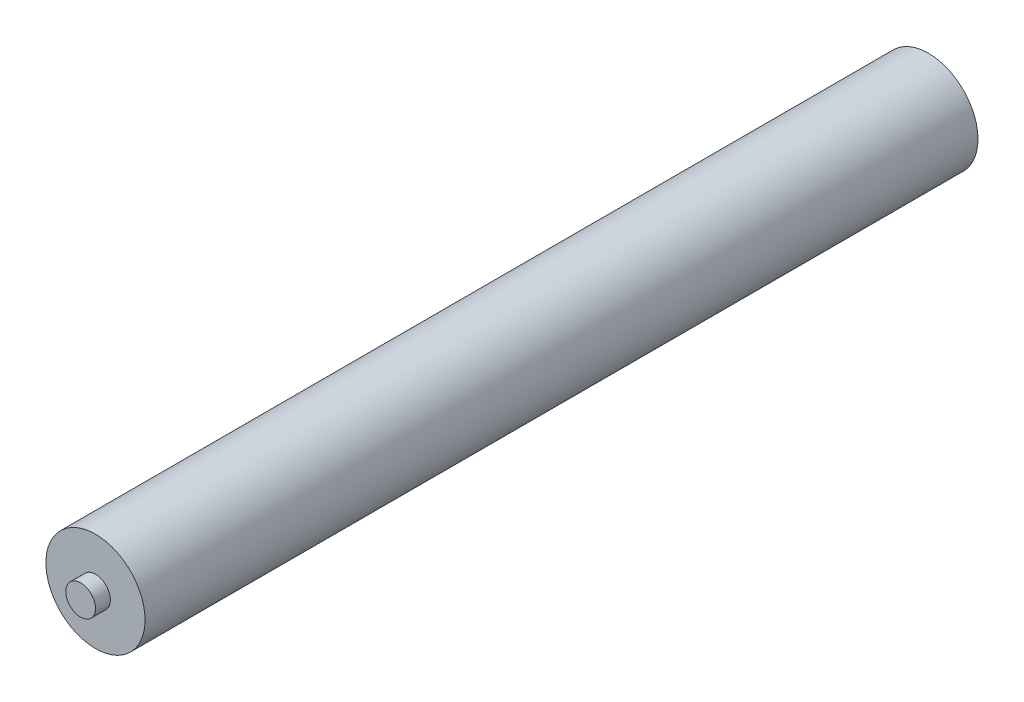
ISO-10303-21;
HEADER;
FILE_DESCRIPTION(('STEP AP214'),'2;1');
FILE_NAME('part.step','',(''),(''),'','','');
FILE_SCHEMA(('AUTOMOTIVE_DESIGN { 1 0 10303 214 1 1 1 1 }'));
ENDSEC;
DATA;
#1=APPLICATION_CONTEXT('core data for automotive mechanical design processes');
#2=APPLICATION_PROTOCOL_DEFINITION('international standard','automotive_design',2000,#1);
#3=PRODUCT_CONTEXT('',#1,'mechanical');
#4=PRODUCT('Part','Part','',(#3));
#5=PRODUCT_RELATED_PRODUCT_CATEGORY('part','',(#4));
#6=PRODUCT_DEFINITION_FORMATION('','',#4);
#7=PRODUCT_DEFINITION_CONTEXT('part definition',#1,'design');
#8=PRODUCT_DEFINITION('design','',#6,#7);
#9=PRODUCT_DEFINITION_SHAPE('','',#8);
#10=(LENGTH_UNIT() NAMED_UNIT(*) SI_UNIT(.MILLI.,.METRE.));
#11=(NAMED_UNIT(*) PLANE_ANGLE_UNIT() SI_UNIT($,.RADIAN.));
#12=(NAMED_UNIT(*) SI_UNIT($,.STERADIAN.) SOLID_ANGLE_UNIT());
#13=UNCERTAINTY_MEASURE_WITH_UNIT(LENGTH_MEASURE(1.E-05),#10,'distance_accuracy_value','');
#14=(GEOMETRIC_REPRESENTATION_CONTEXT(3) GLOBAL_UNCERTAINTY_ASSIGNED_CONTEXT((#13)) GLOBAL_UNIT_ASSIGNED_CONTEXT((#10,
#11,#12)) REPRESENTATION_CONTEXT('',''));
#15=CARTESIAN_POINT('',(0.,0.,0.));
#16=DIRECTION('',(0.,0.,1.));
#17=DIRECTION('',(1.,0.,0.));
#18=AXIS2_PLACEMENT_3D('',#15,#16,#17);
#19=CARTESIAN_POINT('',(0.,0.,420.));
#20=DIRECTION('',(0.,0.,-1.));
#21=DIRECTION('',(-1.,0.,0.));
#22=AXIS2_PLACEMENT_3D('',#19,#20,#21);
#23=CYLINDRICAL_SURFACE('',#22,50.);
#24=CARTESIAN_POINT('',(0.,0.,420.));
#25=DIRECTION('',(0.,0.,1.));
#26=DIRECTION('',(1.,0.,0.));
#27=AXIS2_PLACEMENT_3D('',#24,#25,#26);
#28=CIRCLE('',#27,50.);
#29=CARTESIAN_POINT('',(50.,0.,420.));
#30=VERTEX_POINT('',#29);
#31=EDGE_CURVE('E37',#30,#30,#28,.T.);
#32=ORIENTED_EDGE('',*,*,#31,.F.);
#33=EDGE_LOOP('',(#32));
#34=FACE_BOUND('',#33,.T.);
#35=CARTESIAN_POINT('',(0.,0.,-420.));
#36=DIRECTION('',(0.,0.,1.));
#37=DIRECTION('',(1.,0.,0.));
#38=AXIS2_PLACEMENT_3D('',#35,#36,#37);
#39=CIRCLE('',#38,50.);
#40=CARTESIAN_POINT('',(50.,0.,-420.));
#41=VERTEX_POINT('',#40);
#42=EDGE_CURVE('E41',#41,#41,#39,.T.);
#43=ORIENTED_EDGE('',*,*,#42,.T.);
#44=EDGE_LOOP('',(#43));
#45=FACE_BOUND('',#44,.T.);
#46=ADVANCED_FACE('F31',(#34,#45),#23,.T.);
#47=CARTESIAN_POINT('',(0.,0.,420.));
#48=DIRECTION('',(0.,0.,1.));
#49=DIRECTION('',(1.,0.,0.));
#50=AXIS2_PLACEMENT_3D('',#47,#48,#49);
#51=PLANE('',#50);
#52=CARTESIAN_POINT('',(0.,0.,420.));
#53=DIRECTION('',(0.,0.,1.));
#54=DIRECTION('',(1.,0.,0.));
#55=AXIS2_PLACEMENT_3D('',#52,#53,#54);
#56=CIRCLE('',#55,15.);
#57=CARTESIAN_POINT('',(-15.,0.,420.));
#58=VERTEX_POINT('',#57);
#59=EDGE_CURVE('E46',#58,#58,#56,.F.);
#60=ORIENTED_EDGE('',*,*,#59,.T.);
#61=EDGE_LOOP('',(#60));
#62=FACE_BOUND('',#61,.T.);
#63=ORIENTED_EDGE('',*,*,#31,.T.);
#64=EDGE_LOOP('',(#63));
#65=FACE_BOUND('',#64,.T.);
#66=ADVANCED_FACE('F75',(#62,#65),#51,.T.);
#67=CARTESIAN_POINT('',(0.,0.,-420.));
#68=DIRECTION('',(0.,0.,1.));
#69=DIRECTION('',(1.,0.,0.));
#70=AXIS2_PLACEMENT_3D('',#67,#68,#69);
#71=PLANE('',#70);
#72=CARTESIAN_POINT('',(0.,0.,-420.));
#73=DIRECTION('',(0.,0.,1.));
#74=DIRECTION('',(1.,0.,0.));
#75=AXIS2_PLACEMENT_3D('',#72,#73,#74);
#76=CIRCLE('',#75,15.);
#77=CARTESIAN_POINT('',(-15.,0.,-420.));
#78=VERTEX_POINT('',#77);
#79=EDGE_CURVE('E10',#78,#78,#76,.F.);
#80=ORIENTED_EDGE('',*,*,#79,.F.);
#81=EDGE_LOOP('',(#80));
#82=FACE_BOUND('',#81,.T.);
#83=ORIENTED_EDGE('',*,*,#42,.F.);
#84=EDGE_LOOP('',(#83));
#85=FACE_BOUND('',#84,.T.);
#86=ADVANCED_FACE('F80',(#82,#85),#71,.F.);
#87=CARTESIAN_POINT('',(0.,0.,-435.));
#88=DIRECTION('',(0.,0.,1.));
#89=DIRECTION('',(1.,0.,0.));
#90=AXIS2_PLACEMENT_3D('',#87,#88,#89);
#91=PLANE('',#90);
#92=CARTESIAN_POINT('',(0.,0.,-435.));
#93=DIRECTION('',(0.,0.,1.));
#94=DIRECTION('',(1.,0.,0.));
#95=AXIS2_PLACEMENT_3D('',#92,#93,#94);
#96=CIRCLE('',#95,15.);
#97=CARTESIAN_POINT('',(-15.,0.,-435.));
#98=VERTEX_POINT('',#97);
#99=EDGE_CURVE('E51',#98,#98,#96,.T.);
#100=ORIENTED_EDGE('',*,*,#99,.F.);
#101=EDGE_LOOP('',(#100));
#102=FACE_BOUND('',#101,.T.);
#103=ADVANCED_FACE('F69',(#102),#91,.F.);
#104=CARTESIAN_POINT('',(0.,0.,435.));
#105=DIRECTION('',(0.,0.,-1.));
#106=DIRECTION('',(-1.,0.,0.));
#107=AXIS2_PLACEMENT_3D('',#104,#105,#106);
#108=CYLINDRICAL_SURFACE('',#107,15.);
#109=CARTESIAN_POINT('',(-15.,0.,-435.));
#110=CARTESIAN_POINT('',(-15.,0.,-434.84375));
#111=CARTESIAN_POINT('',(-15.,0.,-434.6875));
#112=CARTESIAN_POINT('',(-15.,0.,-434.375));
#113=CARTESIAN_POINT('',(-15.,0.,-434.21875));
#114=CARTESIAN_POINT('',(-15.,0.,-433.90625));
#115=CARTESIAN_POINT('',(-15.,0.,-433.75));
#116=CARTESIAN_POINT('',(-15.,0.,-433.4375));
#117=CARTESIAN_POINT('',(-15.,0.,-433.28125));
#118=CARTESIAN_POINT('',(-15.,0.,-432.96875));
#119=CARTESIAN_POINT('',(-15.,0.,-432.8125));
#120=CARTESIAN_POINT('',(-15.,0.,-432.5));
#121=CARTESIAN_POINT('',(-15.,0.,-432.34375));
#122=CARTESIAN_POINT('',(-15.,0.,-432.03125));
#123=CARTESIAN_POINT('',(-15.,0.,-431.875));
#124=CARTESIAN_POINT('',(-15.,0.,-431.5625));
#125=CARTESIAN_POINT('',(-15.,0.,-431.40625));
#126=CARTESIAN_POINT('',(-15.,0.,-431.09375));
#127=CARTESIAN_POINT('',(-15.,0.,-430.9375));
#128=CARTESIAN_POINT('',(-15.,0.,-430.625));
#129=CARTESIAN_POINT('',(-15.,0.,-430.46875));
#130=CARTESIAN_POINT('',(-15.,0.,-430.15625));
#131=CARTESIAN_POINT('',(-15.,0.,-430.));
#132=CARTESIAN_POINT('',(-15.,0.,-429.6875));
#133=CARTESIAN_POINT('',(-15.,0.,-429.53125));
#134=CARTESIAN_POINT('',(-15.,0.,-429.21875));
#135=CARTESIAN_POINT('',(-15.,0.,-429.0625));
#136=CARTESIAN_POINT('',(-15.,0.,-428.75));
#137=CARTESIAN_POINT('',(-15.,0.,-428.59375));
#138=CARTESIAN_POINT('',(-15.,0.,-428.28125));
#139=CARTESIAN_POINT('',(-15.,0.,-428.125));
#140=CARTESIAN_POINT('',(-15.,0.,-427.8125));
#141=CARTESIAN_POINT('',(-15.,0.,-427.65625));
#142=CARTESIAN_POINT('',(-15.,0.,-427.34375));
#143=CARTESIAN_POINT('',(-15.,0.,-427.1875));
#144=CARTESIAN_POINT('',(-15.,0.,-426.875));
#145=CARTESIAN_POINT('',(-15.,0.,-426.71875));
#146=CARTESIAN_POINT('',(-15.,0.,-426.40625));
#147=CARTESIAN_POINT('',(-15.,0.,-426.25));
#148=CARTESIAN_POINT('',(-15.,0.,-425.9375));
#149=CARTESIAN_POINT('',(-15.,0.,-425.78125));
#150=CARTESIAN_POINT('',(-15.,0.,-425.46875));
#151=CARTESIAN_POINT('',(-15.,0.,-425.3125));
#152=CARTESIAN_POINT('',(-15.,0.,-425.));
#153=CARTESIAN_POINT('',(-15.,0.,-424.84375));
#154=CARTESIAN_POINT('',(-15.,0.,-424.53125));
#155=CARTESIAN_POINT('',(-15.,0.,-424.375));
#156=CARTESIAN_POINT('',(-15.,0.,-424.0625));
#157=CARTESIAN_POINT('',(-15.,0.,-423.90625));
#158=CARTESIAN_POINT('',(-15.,0.,-423.59375));
#159=CARTESIAN_POINT('',(-15.,0.,-423.4375));
#160=CARTESIAN_POINT('',(-15.,0.,-423.125));
#161=CARTESIAN_POINT('',(-15.,0.,-422.96875));
#162=CARTESIAN_POINT('',(-15.,0.,-422.65625));
#163=CARTESIAN_POINT('',(-15.,0.,-422.5));
#164=CARTESIAN_POINT('',(-15.,0.,-422.1875));
#165=CARTESIAN_POINT('',(-15.,0.,-422.03125));
#166=CARTESIAN_POINT('',(-15.,0.,-421.71875));
#167=CARTESIAN_POINT('',(-15.,0.,-421.5625));
#168=CARTESIAN_POINT('',(-15.,0.,-421.25));
#169=CARTESIAN_POINT('',(-15.,0.,-421.09375));
#170=CARTESIAN_POINT('',(-15.,0.,-420.78125));
#171=CARTESIAN_POINT('',(-15.,0.,-420.625));
#172=CARTESIAN_POINT('',(-15.,0.,-420.3125));
#173=CARTESIAN_POINT('',(-15.,0.,-420.15625));
#174=CARTESIAN_POINT('',(-15.,0.,-420.));
#175=B_SPLINE_CURVE_WITH_KNOTS('',3,(#109,#110,#111,#112,#113,#114,#115,#116,#117,#118,#119,
#120,#121,#122,#123,#124,#125,#126,#127,#128,#129,#130,#131,#132,#133,#134,#135,#136,#137,#138,
#139,#140,#141,#142,#143,#144,#145,#146,#147,#148,#149,#150,#151,#152,#153,#154,#155,#156,#157,
#158,#159,#160,#161,#162,#163,#164,#165,#166,#167,#168,#169,#170,#171,#172,#173,#174),
.UNSPECIFIED.,.F.,.F.,(4,2,2,2,2,2,2,2,2,2,2,2,2,2,2,2,2,2,2,2,2,2,2,2,2,2,2,2,2,2,2,2,4),(0.,
0.468750000000018,0.937500000000036,1.40624999999994,1.87499999999996,2.34374999999998,2.8125,
3.28125000000001,3.74999999999992,4.21874999999994,4.68749999999996,5.15624999999997,
5.62499999999999,6.09375000000001,6.56249999999992,7.03124999999993,7.49999999999995,
7.96874999999997,8.43749999999999,8.90624999999989,9.37499999999991,9.84374999999993,
10.3124999999999,10.78125,11.25,11.7187499999999,12.1874999999999,12.6562499999999,
13.1249999999999,13.59375,14.0624999999999,14.5312499999999,14.9999999999999),.UNSPECIFIED.);
#176=EDGE_CURVE('BSEAM61',#98,#78,#175,.T.);
#177=ORIENTED_EDGE('',*,*,#99,.T.);
#178=ORIENTED_EDGE('',*,*,#79,.T.);
#179=ORIENTED_EDGE('',*,*,#176,.T.);
#180=ORIENTED_EDGE('',*,*,#176,.F.);
#181=EDGE_LOOP('',(#177,#179,#178,#180));
#182=FACE_BOUND('',#181,.T.);
#183=ADVANCED_FACE('F61',(#182),#108,.T.);
#184=CARTESIAN_POINT('',(0.,0.,435.));
#185=DIRECTION('',(0.,0.,1.));
#186=DIRECTION('',(1.,0.,0.));
#187=AXIS2_PLACEMENT_3D('',#184,#185,#186);
#188=CIRCLE('',#187,15.);
#189=CARTESIAN_POINT('',(-15.,0.,435.));
#190=VERTEX_POINT('',#189);
#191=EDGE_CURVE('E50',#190,#190,#188,.T.);
#192=CARTESIAN_POINT('',(-15.,0.,420.));
#193=CARTESIAN_POINT('',(-15.,0.,420.15625));
#194=CARTESIAN_POINT('',(-15.,0.,420.3125));
#195=CARTESIAN_POINT('',(-15.,0.,420.625));
#196=CARTESIAN_POINT('',(-15.,0.,420.78125));
#197=CARTESIAN_POINT('',(-15.,0.,421.09375));
#198=CARTESIAN_POINT('',(-15.,0.,421.25));
#199=CARTESIAN_POINT('',(-15.,0.,421.5625));
#200=CARTESIAN_POINT('',(-15.,0.,421.71875));
#201=CARTESIAN_POINT('',(-15.,0.,422.03125));
#202=CARTESIAN_POINT('',(-15.,0.,422.1875));
#203=CARTESIAN_POINT('',(-15.,0.,422.5));
#204=CARTESIAN_POINT('',(-15.,0.,422.65625));
#205=CARTESIAN_POINT('',(-15.,0.,422.96875));
#206=CARTESIAN_POINT('',(-15.,0.,423.125));
#207=CARTESIAN_POINT('',(-15.,0.,423.4375));
#208=CARTESIAN_POINT('',(-15.,0.,423.59375));
#209=CARTESIAN_POINT('',(-15.,0.,423.90625));
#210=CARTESIAN_POINT('',(-15.,0.,424.0625));
#211=CARTESIAN_POINT('',(-15.,0.,424.375));
#212=CARTESIAN_POINT('',(-15.,0.,424.53125));
#213=CARTESIAN_POINT('',(-15.,0.,424.84375));
#214=CARTESIAN_POINT('',(-15.,0.,425.));
#215=CARTESIAN_POINT('',(-15.,0.,425.3125));
#216=CARTESIAN_POINT('',(-15.,0.,425.46875));
#217=CARTESIAN_POINT('',(-15.,0.,425.78125));
#218=CARTESIAN_POINT('',(-15.,0.,425.9375));
#219=CARTESIAN_POINT('',(-15.,0.,426.25));
#220=CARTESIAN_POINT('',(-15.,0.,426.40625));
#221=CARTESIAN_POINT('',(-15.,0.,426.71875));
#222=CARTESIAN_POINT('',(-15.,0.,426.875));
#223=CARTESIAN_POINT('',(-15.,0.,427.1875));
#224=CARTESIAN_POINT('',(-15.,0.,427.34375));
#225=CARTESIAN_POINT('',(-15.,0.,427.65625));
#226=CARTESIAN_POINT('',(-15.,0.,427.8125));
#227=CARTESIAN_POINT('',(-15.,0.,428.125));
#228=CARTESIAN_POINT('',(-15.,0.,428.28125));
#229=CARTESIAN_POINT('',(-15.,0.,428.59375));
#230=CARTESIAN_POINT('',(-15.,0.,428.75));
#231=CARTESIAN_POINT('',(-15.,0.,429.0625));
#232=CARTESIAN_POINT('',(-15.,0.,429.21875));
#233=CARTESIAN_POINT('',(-15.,0.,429.53125));
#234=CARTESIAN_POINT('',(-15.,0.,429.6875));
#235=CARTESIAN_POINT('',(-15.,0.,430.));
#236=CARTESIAN_POINT('',(-15.,0.,430.15625));
#237=CARTESIAN_POINT('',(-15.,0.,430.46875));
#238=CARTESIAN_POINT('',(-15.,0.,430.625));
#239=CARTESIAN_POINT('',(-15.,0.,430.9375));
#240=CARTESIAN_POINT('',(-15.,0.,431.09375));
#241=CARTESIAN_POINT('',(-15.,0.,431.40625));
#242=CARTESIAN_POINT('',(-15.,0.,431.5625));
#243=CARTESIAN_POINT('',(-15.,0.,431.875));
#244=CARTESIAN_POINT('',(-15.,0.,432.03125));
#245=CARTESIAN_POINT('',(-15.,0.,432.34375));
#246=CARTESIAN_POINT('',(-15.,0.,432.5));
#247=CARTESIAN_POINT('',(-15.,0.,432.8125));
#248=CARTESIAN_POINT('',(-15.,0.,432.96875));
#249=CARTESIAN_POINT('',(-15.,0.,433.28125));
#250=CARTESIAN_POINT('',(-15.,0.,433.4375));
#251=CARTESIAN_POINT('',(-15.,0.,433.75));
#252=CARTESIAN_POINT('',(-15.,0.,433.90625));
#253=CARTESIAN_POINT('',(-15.,0.,434.21875));
#254=CARTESIAN_POINT('',(-15.,0.,434.375));
#255=CARTESIAN_POINT('',(-15.,0.,434.6875));
#256=CARTESIAN_POINT('',(-15.,0.,434.84375));
#257=CARTESIAN_POINT('',(-15.,0.,435.));
#258=B_SPLINE_CURVE_WITH_KNOTS('',3,(#192,#193,#194,#195,#196,#197,#198,#199,#200,#201,#202,
#203,#204,#205,#206,#207,#208,#209,#210,#211,#212,#213,#214,#215,#216,#217,#218,#219,#220,#221,
#222,#223,#224,#225,#226,#227,#228,#229,#230,#231,#232,#233,#234,#235,#236,#237,#238,#239,#240,
#241,#242,#243,#244,#245,#246,#247,#248,#249,#250,#251,#252,#253,#254,#255,#256,#257),
.UNSPECIFIED.,.F.,.F.,(4,2,2,2,2,2,2,2,2,2,2,2,2,2,2,2,2,2,2,2,2,2,2,2,2,2,2,2,2,2,2,2,4),(0.,
0.468749999999962,0.93749999999998,1.40625,1.87499999999996,2.34374999999998,2.8125,
3.28124999999996,3.74999999999998,4.21874999999999,4.68749999999996,5.15624999999997,
5.62499999999999,6.09374999999995,6.56249999999997,7.03124999999999,7.50000000000001,
7.96874999999997,8.43749999999999,8.90625,9.37499999999997,9.84374999999998,10.3125,10.78125,
11.25,11.71875,12.1875,12.65625,13.125,13.59375,14.0625,14.53125,15.),.UNSPECIFIED.);
#259=EDGE_CURVE('BSEAM59',#58,#190,#258,.T.);
#260=ORIENTED_EDGE('',*,*,#59,.F.);
#261=ORIENTED_EDGE('',*,*,#191,.F.);
#262=ORIENTED_EDGE('',*,*,#259,.T.);
#263=ORIENTED_EDGE('',*,*,#259,.F.);
#264=EDGE_LOOP('',(#260,#262,#261,#263));
#265=FACE_BOUND('',#264,.T.);
#266=ADVANCED_FACE('F59',(#265),#108,.T.);
#267=CARTESIAN_POINT('',(0.,0.,435.));
#268=DIRECTION('',(0.,0.,1.));
#269=DIRECTION('',(1.,0.,0.));
#270=AXIS2_PLACEMENT_3D('',#267,#268,#269);
#271=PLANE('',#270);
#272=ORIENTED_EDGE('',*,*,#191,.T.);
#273=EDGE_LOOP('',(#272));
#274=FACE_BOUND('',#273,.T.);
#275=ADVANCED_FACE('F57',(#274),#271,.T.);
#276=CLOSED_SHELL('',(#46,#66,#86,#103,#183,#266,#275));
#277=MANIFOLD_SOLID_BREP('B2',#276);
#278=ADVANCED_BREP_SHAPE_REPRESENTATION('',(#18,#277),#14);
#279=SHAPE_DEFINITION_REPRESENTATION(#9,#278);
ENDSEC;
END-ISO-10303-21;
